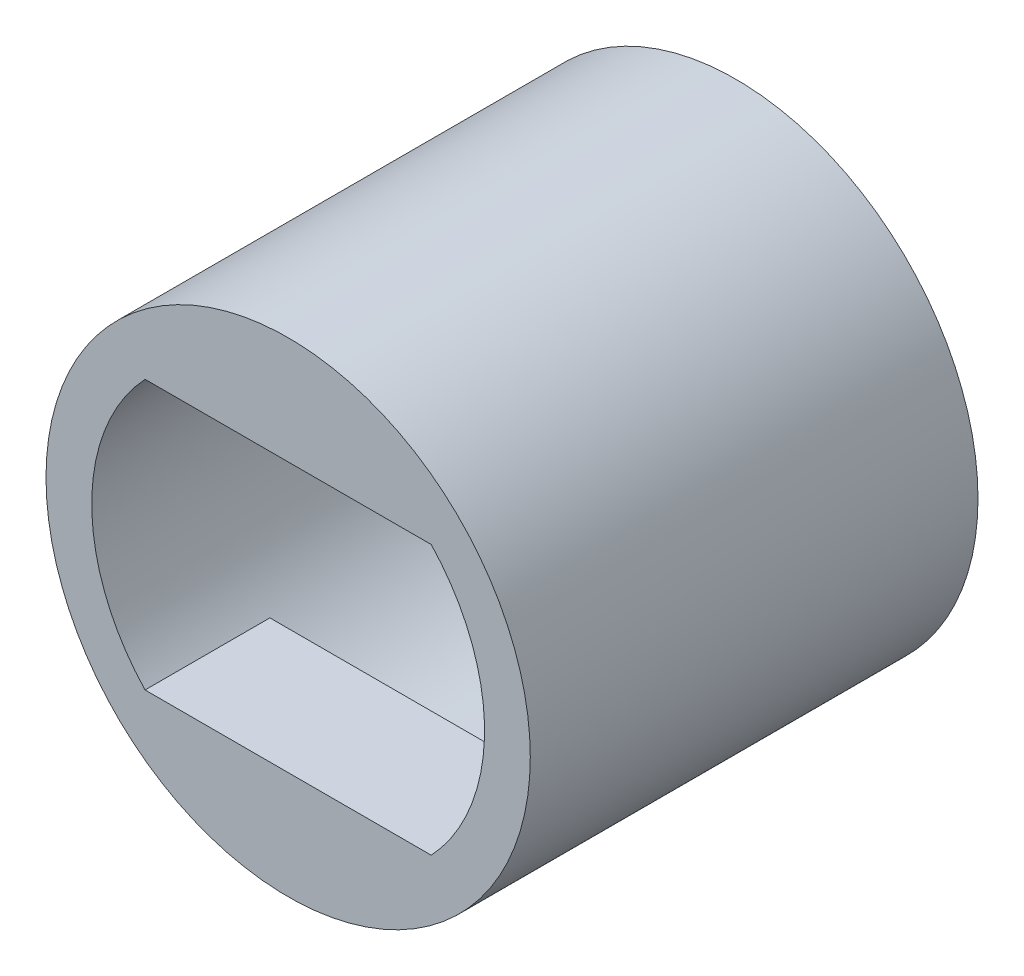
ISO-10303-21;
HEADER;
FILE_DESCRIPTION(('STEP AP214'),'2;1');
FILE_NAME('part.step','',(''),(''),'','','');
FILE_SCHEMA(('AUTOMOTIVE_DESIGN { 1 0 10303 214 1 1 1 1 }'));
ENDSEC;
DATA;
#1=APPLICATION_CONTEXT('core data for automotive mechanical design processes');
#2=APPLICATION_PROTOCOL_DEFINITION('international standard','automotive_design',2000,#1);
#3=PRODUCT_CONTEXT('',#1,'mechanical');
#4=PRODUCT('Part','Part','',(#3));
#5=PRODUCT_RELATED_PRODUCT_CATEGORY('part','',(#4));
#6=PRODUCT_DEFINITION_FORMATION('','',#4);
#7=PRODUCT_DEFINITION_CONTEXT('part definition',#1,'design');
#8=PRODUCT_DEFINITION('design','',#6,#7);
#9=PRODUCT_DEFINITION_SHAPE('','',#8);
#10=(LENGTH_UNIT() NAMED_UNIT(*) SI_UNIT(.MILLI.,.METRE.));
#11=(NAMED_UNIT(*) PLANE_ANGLE_UNIT() SI_UNIT($,.RADIAN.));
#12=(NAMED_UNIT(*) SI_UNIT($,.STERADIAN.) SOLID_ANGLE_UNIT());
#13=UNCERTAINTY_MEASURE_WITH_UNIT(LENGTH_MEASURE(1.E-05),#10,'distance_accuracy_value','');
#14=(GEOMETRIC_REPRESENTATION_CONTEXT(3) GLOBAL_UNCERTAINTY_ASSIGNED_CONTEXT((#13)) GLOBAL_UNIT_ASSIGNED_CONTEXT((#10,
#11,#12)) REPRESENTATION_CONTEXT('',''));
#15=CARTESIAN_POINT('',(0.,0.,0.));
#16=DIRECTION('',(0.,0.,1.));
#17=DIRECTION('',(1.,0.,0.));
#18=AXIS2_PLACEMENT_3D('',#15,#16,#17);
#19=CARTESIAN_POINT('',(-18.7082869338697,-12.5,41.6));
#20=DIRECTION('',(0.,-1.,0.));
#21=DIRECTION('',(1.,0.,0.));
#22=AXIS2_PLACEMENT_3D('',#19,#20,#21);
#23=PLANE('',#22);
#24=DIRECTION('',(0.,0.,-1.));
#25=VECTOR('',#24,1.);
#26=CARTESIAN_POINT('',(13.2970861469722,-12.5,68.2400755138992));
#27=LINE('',#26,#25);
#28=CARTESIAN_POINT('',(13.2970861469722,-12.5,41.6));
#29=VERTEX_POINT('',#28);
#30=CARTESIAN_POINT('',(13.2970861469722,-12.5,30.));
#31=VERTEX_POINT('',#30);
#32=EDGE_CURVE('E63',#29,#31,#27,.T.);
#33=ORIENTED_EDGE('',*,*,#32,.T.);
#34=DIRECTION('',(-1.,0.,0.));
#35=VECTOR('',#34,1.);
#36=CARTESIAN_POINT('',(-18.7082869338697,-12.5,30.));
#37=LINE('',#36,#35);
#38=CARTESIAN_POINT('',(-13.2970861469722,-12.5,30.));
#39=VERTEX_POINT('',#38);
#40=EDGE_CURVE('E113',#31,#39,#37,.T.);
#41=ORIENTED_EDGE('',*,*,#40,.T.);
#42=DIRECTION('',(0.,0.,-1.));
#43=VECTOR('',#42,1.);
#44=CARTESIAN_POINT('',(-13.2970861469722,-12.5,68.2400755138992));
#45=LINE('',#44,#43);
#46=CARTESIAN_POINT('',(-13.2970861469722,-12.5,41.6));
#47=VERTEX_POINT('',#46);
#48=EDGE_CURVE('E80',#47,#39,#45,.T.);
#49=ORIENTED_EDGE('',*,*,#48,.F.);
#50=DIRECTION('',(-1.,0.,0.));
#51=VECTOR('',#50,1.);
#52=CARTESIAN_POINT('',(-18.7082869338697,-12.5,41.6));
#53=LINE('',#52,#51);
#54=EDGE_CURVE('E91',#29,#47,#53,.T.);
#55=ORIENTED_EDGE('',*,*,#54,.F.);
#56=EDGE_LOOP('',(#33,#41,#49,#55));
#57=FACE_BOUND('',#56,.T.);
#58=ADVANCED_FACE('F39',(#57),#23,.F.);
#59=CARTESIAN_POINT('',(-18.7082869338697,12.5,41.6));
#60=DIRECTION('',(0.,1.,0.));
#61=DIRECTION('',(0.,0.,1.));
#62=AXIS2_PLACEMENT_3D('',#59,#60,#61);
#63=PLANE('',#62);
#64=DIRECTION('',(0.,0.,-1.));
#65=VECTOR('',#64,1.);
#66=CARTESIAN_POINT('',(13.2970861469722,12.5,68.2400755138992));
#67=LINE('',#66,#65);
#68=CARTESIAN_POINT('',(13.2970861469722,12.5,41.6));
#69=VERTEX_POINT('',#68);
#70=CARTESIAN_POINT('',(13.2970861469722,12.5,30.));
#71=VERTEX_POINT('',#70);
#72=EDGE_CURVE('E89',#69,#71,#67,.T.);
#73=ORIENTED_EDGE('',*,*,#72,.F.);
#74=DIRECTION('',(1.,0.,0.));
#75=VECTOR('',#74,1.);
#76=CARTESIAN_POINT('',(-18.7082869338697,12.5,41.6));
#77=LINE('',#76,#75);
#78=CARTESIAN_POINT('',(-13.2970861469722,12.5,41.6));
#79=VERTEX_POINT('',#78);
#80=EDGE_CURVE('E97',#79,#69,#77,.T.);
#81=ORIENTED_EDGE('',*,*,#80,.F.);
#82=DIRECTION('',(0.,0.,-1.));
#83=VECTOR('',#82,1.);
#84=CARTESIAN_POINT('',(-13.2970861469722,12.5,68.2400755138992));
#85=LINE('',#84,#83);
#86=CARTESIAN_POINT('',(-13.2970861469722,12.5,30.));
#87=VERTEX_POINT('',#86);
#88=EDGE_CURVE('E119',#79,#87,#85,.T.);
#89=ORIENTED_EDGE('',*,*,#88,.T.);
#90=DIRECTION('',(1.,0.,0.));
#91=VECTOR('',#90,1.);
#92=CARTESIAN_POINT('',(-18.7082869338697,12.5,30.));
#93=LINE('',#92,#91);
#94=EDGE_CURVE('E99',#87,#71,#93,.T.);
#95=ORIENTED_EDGE('',*,*,#94,.T.);
#96=EDGE_LOOP('',(#73,#81,#89,#95));
#97=FACE_BOUND('',#96,.T.);
#98=ADVANCED_FACE('F96',(#97),#63,.F.);
#99=CARTESIAN_POINT('',(0.,0.,0.));
#100=DIRECTION('',(0.,0.,1.));
#101=DIRECTION('',(1.,0.,0.));
#102=AXIS2_PLACEMENT_3D('',#99,#100,#101);
#103=PLANE('',#102);
#104=CARTESIAN_POINT('',(0.,0.,0.));
#105=DIRECTION('',(0.,0.,1.));
#106=DIRECTION('',(1.,0.,0.));
#107=AXIS2_PLACEMENT_3D('',#104,#105,#106);
#108=CIRCLE('',#107,22.5);
#109=CARTESIAN_POINT('',(22.5,0.,0.));
#110=VERTEX_POINT('',#109);
#111=EDGE_CURVE('E11',#110,#110,#108,.T.);
#112=ORIENTED_EDGE('',*,*,#111,.F.);
#113=EDGE_LOOP('',(#112));
#114=FACE_BOUND('',#113,.T.);
#115=CARTESIAN_POINT('',(0.,0.,0.));
#116=DIRECTION('',(0.,0.,1.));
#117=DIRECTION('',(1.,0.,0.));
#118=AXIS2_PLACEMENT_3D('',#115,#116,#117);
#119=CIRCLE('',#118,18.25);
#120=CARTESIAN_POINT('',(18.25,0.,0.));
#121=VERTEX_POINT('',#120);
#122=EDGE_CURVE('E103',#121,#121,#119,.T.);
#123=ORIENTED_EDGE('',*,*,#122,.T.);
#124=EDGE_LOOP('',(#123));
#125=FACE_BOUND('',#124,.T.);
#126=ADVANCED_FACE('F129',(#114,#125),#103,.F.);
#127=CARTESIAN_POINT('',(0.,0.,30.));
#128=DIRECTION('',(0.,0.,-1.));
#129=DIRECTION('',(-1.,0.,0.));
#130=AXIS2_PLACEMENT_3D('',#127,#128,#129);
#131=CYLINDRICAL_SURFACE('',#130,22.5);
#132=CARTESIAN_POINT('',(0.,0.,41.6));
#133=DIRECTION('',(0.,0.,1.));
#134=DIRECTION('',(1.,0.,0.));
#135=AXIS2_PLACEMENT_3D('',#132,#133,#134);
#136=CIRCLE('',#135,22.5);
#137=CARTESIAN_POINT('',(22.5,0.,41.6));
#138=VERTEX_POINT('',#137);
#139=EDGE_CURVE('E104',#138,#138,#136,.T.);
#140=ORIENTED_EDGE('',*,*,#139,.F.);
#141=EDGE_LOOP('',(#140));
#142=FACE_BOUND('',#141,.T.);
#143=ORIENTED_EDGE('',*,*,#111,.T.);
#144=EDGE_LOOP('',(#143));
#145=FACE_BOUND('',#144,.T.);
#146=ADVANCED_FACE('F41',(#142,#145),#131,.T.);
#147=CARTESIAN_POINT('',(0.,0.,30.));
#148=DIRECTION('',(0.,0.,-1.));
#149=DIRECTION('',(-1.,0.,0.));
#150=AXIS2_PLACEMENT_3D('',#147,#148,#149);
#151=CYLINDRICAL_SURFACE('',#150,18.25);
#152=CARTESIAN_POINT('',(0.,0.,30.));
#153=DIRECTION('',(0.,0.,1.));
#154=DIRECTION('',(1.,0.,0.));
#155=AXIS2_PLACEMENT_3D('',#152,#153,#154);
#156=CIRCLE('',#155,18.25);
#157=EDGE_CURVE('E47',#71,#87,#156,.T.);
#158=ORIENTED_EDGE('',*,*,#157,.T.);
#159=ORIENTED_EDGE('',*,*,#88,.F.);
#160=CARTESIAN_POINT('',(0.,0.,41.6));
#161=DIRECTION('',(0.,0.,1.));
#162=DIRECTION('',(1.,0.,0.));
#163=AXIS2_PLACEMENT_3D('',#160,#161,#162);
#164=CIRCLE('',#163,18.25);
#165=EDGE_CURVE('E54',#47,#79,#164,.F.);
#166=ORIENTED_EDGE('',*,*,#165,.F.);
#167=ORIENTED_EDGE('',*,*,#48,.T.);
#168=EDGE_CURVE('E107',#39,#31,#156,.T.);
#169=ORIENTED_EDGE('',*,*,#168,.T.);
#170=ORIENTED_EDGE('',*,*,#32,.F.);
#171=CARTESIAN_POINT('',(0.,0.,41.6));
#172=DIRECTION('',(0.,0.,1.));
#173=DIRECTION('',(1.,0.,0.));
#174=AXIS2_PLACEMENT_3D('',#171,#172,#173);
#175=CIRCLE('',#174,18.25);
#176=EDGE_CURVE('E84',#69,#29,#175,.F.);
#177=ORIENTED_EDGE('',*,*,#176,.F.);
#178=ORIENTED_EDGE('',*,*,#72,.T.);
#179=EDGE_LOOP('',(#158,#159,#166,#167,#169,#170,#177,#178));
#180=FACE_BOUND('',#179,.T.);
#181=ORIENTED_EDGE('',*,*,#122,.F.);
#182=EDGE_LOOP('',(#181));
#183=FACE_BOUND('',#182,.T.);
#184=ADVANCED_FACE('F87',(#180,#183),#151,.F.);
#185=CARTESIAN_POINT('',(0.,0.,30.));
#186=DIRECTION('',(0.,0.,1.));
#187=DIRECTION('',(1.,0.,0.));
#188=AXIS2_PLACEMENT_3D('',#185,#186,#187);
#189=PLANE('',#188);
#190=ORIENTED_EDGE('',*,*,#168,.F.);
#191=ORIENTED_EDGE('',*,*,#40,.F.);
#192=EDGE_LOOP('',(#190,#191));
#193=FACE_BOUND('',#192,.T.);
#194=ADVANCED_FACE('F118',(#193),#189,.F.);
#195=CARTESIAN_POINT('',(0.,0.,41.6));
#196=DIRECTION('',(0.,0.,1.));
#197=DIRECTION('',(1.,0.,0.));
#198=AXIS2_PLACEMENT_3D('',#195,#196,#197);
#199=PLANE('',#198);
#200=ORIENTED_EDGE('',*,*,#176,.T.);
#201=ORIENTED_EDGE('',*,*,#54,.T.);
#202=ORIENTED_EDGE('',*,*,#165,.T.);
#203=ORIENTED_EDGE('',*,*,#80,.T.);
#204=EDGE_LOOP('',(#200,#201,#202,#203));
#205=FACE_BOUND('',#204,.T.);
#206=ORIENTED_EDGE('',*,*,#139,.T.);
#207=EDGE_LOOP('',(#206));
#208=FACE_BOUND('',#207,.T.);
#209=ADVANCED_FACE('F101',(#205,#208),#199,.T.);
#210=CARTESIAN_POINT('',(0.,0.,30.));
#211=DIRECTION('',(0.,0.,1.));
#212=DIRECTION('',(1.,0.,0.));
#213=AXIS2_PLACEMENT_3D('',#210,#211,#212);
#214=PLANE('',#213);
#215=ORIENTED_EDGE('',*,*,#157,.F.);
#216=ORIENTED_EDGE('',*,*,#94,.F.);
#217=EDGE_LOOP('',(#215,#216));
#218=FACE_BOUND('',#217,.T.);
#219=ADVANCED_FACE('F149',(#218),#214,.F.);
#220=CLOSED_SHELL('',(#58,#98,#126,#146,#184,#194,#209,#219));
#221=MANIFOLD_SOLID_BREP('B2',#220);
#222=ADVANCED_BREP_SHAPE_REPRESENTATION('',(#18,#221),#14);
#223=SHAPE_DEFINITION_REPRESENTATION(#9,#222);
ENDSEC;
END-ISO-10303-21;
